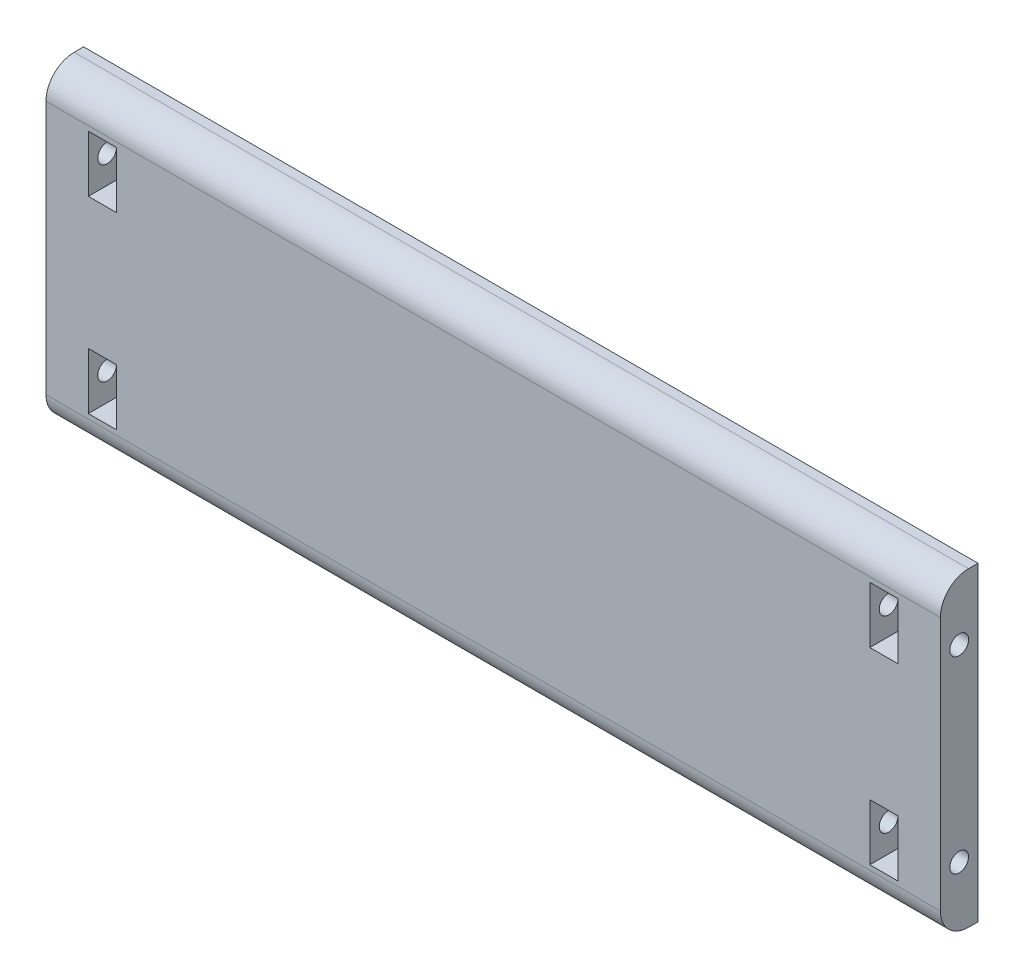
ISO-10303-21;
HEADER;
FILE_DESCRIPTION(('STEP AP214'),'2;1');
FILE_NAME('part.step','',(''),(''),'','','');
FILE_SCHEMA(('AUTOMOTIVE_DESIGN { 1 0 10303 214 1 1 1 1 }'));
ENDSEC;
DATA;
#1=APPLICATION_CONTEXT('core data for automotive mechanical design processes');
#2=APPLICATION_PROTOCOL_DEFINITION('international standard','automotive_design',2000,#1);
#3=PRODUCT_CONTEXT('',#1,'mechanical');
#4=PRODUCT('Part','Part','',(#3));
#5=PRODUCT_RELATED_PRODUCT_CATEGORY('part','',(#4));
#6=PRODUCT_DEFINITION_FORMATION('','',#4);
#7=PRODUCT_DEFINITION_CONTEXT('part definition',#1,'design');
#8=PRODUCT_DEFINITION('design','',#6,#7);
#9=PRODUCT_DEFINITION_SHAPE('','',#8);
#10=(LENGTH_UNIT() NAMED_UNIT(*) SI_UNIT(.MILLI.,.METRE.));
#11=(NAMED_UNIT(*) PLANE_ANGLE_UNIT() SI_UNIT($,.RADIAN.));
#12=(NAMED_UNIT(*) SI_UNIT($,.STERADIAN.) SOLID_ANGLE_UNIT());
#13=UNCERTAINTY_MEASURE_WITH_UNIT(LENGTH_MEASURE(1.E-05),#10,'distance_accuracy_value','');
#14=(GEOMETRIC_REPRESENTATION_CONTEXT(3) GLOBAL_UNCERTAINTY_ASSIGNED_CONTEXT((#13)) GLOBAL_UNIT_ASSIGNED_CONTEXT((#10,
#11,#12)) REPRESENTATION_CONTEXT('',''));
#15=CARTESIAN_POINT('',(0.,0.,0.));
#16=DIRECTION('',(0.,0.,1.));
#17=DIRECTION('',(1.,0.,0.));
#18=AXIS2_PLACEMENT_3D('',#15,#16,#17);
#19=CARTESIAN_POINT('',(0.,0.,4.));
#20=DIRECTION('',(0.,0.,1.));
#21=DIRECTION('',(1.,0.,0.));
#22=AXIS2_PLACEMENT_3D('',#19,#20,#21);
#23=PLANE('',#22);
#24=DIRECTION('',(-1.,0.,0.));
#25=VECTOR('',#24,1.);
#26=CARTESIAN_POINT('',(43.0399999999998,-6.99999999999997,4.));
#27=LINE('',#26,#25);
#28=CARTESIAN_POINT('',(43.0399999999998,-6.99999999999997,4.));
#29=VERTEX_POINT('',#28);
#30=CARTESIAN_POINT('',(40.0399999999998,-6.99999999999997,4.));
#31=VERTEX_POINT('',#30);
#32=EDGE_CURVE('E230',#29,#31,#27,.T.);
#33=ORIENTED_EDGE('',*,*,#32,.F.);
#34=DIRECTION('',(0.,1.,0.));
#35=VECTOR('',#34,1.);
#36=CARTESIAN_POINT('',(43.0399999999998,-6.99999999999997,4.));
#37=LINE('',#36,#35);
#38=CARTESIAN_POINT('',(43.0399999999998,-13.,4.));
#39=VERTEX_POINT('',#38);
#40=EDGE_CURVE('E228',#39,#29,#37,.T.);
#41=ORIENTED_EDGE('',*,*,#40,.F.);
#42=DIRECTION('',(1.,0.,0.));
#43=VECTOR('',#42,1.);
#44=CARTESIAN_POINT('',(43.0399999999998,-13.,4.));
#45=LINE('',#44,#43);
#46=CARTESIAN_POINT('',(40.0399999999998,-13.,4.));
#47=VERTEX_POINT('',#46);
#48=EDGE_CURVE('E236',#47,#39,#45,.T.);
#49=ORIENTED_EDGE('',*,*,#48,.F.);
#50=DIRECTION('',(0.,-1.,0.));
#51=VECTOR('',#50,1.);
#52=CARTESIAN_POINT('',(40.0399999999998,-6.99999999999997,4.));
#53=LINE('',#52,#51);
#54=EDGE_CURVE('E233',#31,#47,#53,.T.);
#55=ORIENTED_EDGE('',*,*,#54,.F.);
#56=EDGE_LOOP('',(#33,#41,#49,#55));
#57=FACE_BOUND('',#56,.T.);
#58=DIRECTION('',(-1.,0.,0.));
#59=VECTOR('',#58,1.);
#60=CARTESIAN_POINT('',(-43.04,13.,4.));
#61=LINE('',#60,#59);
#62=CARTESIAN_POINT('',(-40.04,13.,4.));
#63=VERTEX_POINT('',#62);
#64=CARTESIAN_POINT('',(-43.04,13.,4.));
#65=VERTEX_POINT('',#64);
#66=EDGE_CURVE('E292',#63,#65,#61,.T.);
#67=ORIENTED_EDGE('',*,*,#66,.F.);
#68=DIRECTION('',(0.,1.,0.));
#69=VECTOR('',#68,1.);
#70=CARTESIAN_POINT('',(-40.04,13.,4.));
#71=LINE('',#70,#69);
#72=CARTESIAN_POINT('',(-40.04,7.,4.));
#73=VERTEX_POINT('',#72);
#74=EDGE_CURVE('E290',#73,#63,#71,.T.);
#75=ORIENTED_EDGE('',*,*,#74,.F.);
#76=DIRECTION('',(1.,0.,0.));
#77=VECTOR('',#76,1.);
#78=CARTESIAN_POINT('',(-43.04,7.,4.));
#79=LINE('',#78,#77);
#80=CARTESIAN_POINT('',(-43.04,7.,4.));
#81=VERTEX_POINT('',#80);
#82=EDGE_CURVE('E298',#81,#73,#79,.T.);
#83=ORIENTED_EDGE('',*,*,#82,.F.);
#84=DIRECTION('',(0.,-1.,0.));
#85=VECTOR('',#84,1.);
#86=CARTESIAN_POINT('',(-43.04,13.,4.));
#87=LINE('',#86,#85);
#88=EDGE_CURVE('E295',#65,#81,#87,.T.);
#89=ORIENTED_EDGE('',*,*,#88,.F.);
#90=EDGE_LOOP('',(#67,#75,#83,#89));
#91=FACE_BOUND('',#90,.T.);
#92=DIRECTION('',(0.,1.,0.));
#93=VECTOR('',#92,1.);
#94=CARTESIAN_POINT('',(47.54,16.51,4.));
#95=LINE('',#94,#93);
#96=CARTESIAN_POINT('',(47.54,-13.51,4.));
#97=VERTEX_POINT('',#96);
#98=CARTESIAN_POINT('',(47.54,13.51,4.));
#99=VERTEX_POINT('',#98);
#100=EDGE_CURVE('E321',#97,#99,#95,.T.);
#101=ORIENTED_EDGE('',*,*,#100,.T.);
#102=DIRECTION('',(-1.,0.,0.));
#103=VECTOR('',#102,1.);
#104=CARTESIAN_POINT('',(-47.54,13.51,4.));
#105=LINE('',#104,#103);
#106=CARTESIAN_POINT('',(-47.54,13.51,4.));
#107=VERTEX_POINT('',#106);
#108=EDGE_CURVE('E349',#99,#107,#105,.T.);
#109=ORIENTED_EDGE('',*,*,#108,.T.);
#110=DIRECTION('',(0.,-1.,0.));
#111=VECTOR('',#110,1.);
#112=CARTESIAN_POINT('',(-47.54,16.51,4.));
#113=LINE('',#112,#111);
#114=CARTESIAN_POINT('',(-47.54,-13.51,4.));
#115=VERTEX_POINT('',#114);
#116=EDGE_CURVE('E324',#107,#115,#113,.T.);
#117=ORIENTED_EDGE('',*,*,#116,.T.);
#118=DIRECTION('',(1.,0.,0.));
#119=VECTOR('',#118,1.);
#120=CARTESIAN_POINT('',(47.54,-13.51,4.));
#121=LINE('',#120,#119);
#122=EDGE_CURVE('E346',#115,#97,#121,.T.);
#123=ORIENTED_EDGE('',*,*,#122,.T.);
#124=EDGE_LOOP('',(#101,#109,#117,#123));
#125=FACE_BOUND('',#124,.T.);
#126=DIRECTION('',(-1.,0.,0.));
#127=VECTOR('',#126,1.);
#128=CARTESIAN_POINT('',(-43.0399999999998,-6.99999999999998,4.));
#129=LINE('',#128,#127);
#130=CARTESIAN_POINT('',(-40.0399999999998,-6.99999999999998,4.));
#131=VERTEX_POINT('',#130);
#132=CARTESIAN_POINT('',(-43.0399999999998,-6.99999999999998,4.));
#133=VERTEX_POINT('',#132);
#134=EDGE_CURVE('E261',#131,#133,#129,.T.);
#135=ORIENTED_EDGE('',*,*,#134,.F.);
#136=DIRECTION('',(0.,1.,0.));
#137=VECTOR('',#136,1.);
#138=CARTESIAN_POINT('',(-40.0399999999998,-6.99999999999998,4.));
#139=LINE('',#138,#137);
#140=CARTESIAN_POINT('',(-40.0399999999998,-13.,4.));
#141=VERTEX_POINT('',#140);
#142=EDGE_CURVE('E259',#141,#131,#139,.T.);
#143=ORIENTED_EDGE('',*,*,#142,.F.);
#144=DIRECTION('',(1.,0.,0.));
#145=VECTOR('',#144,1.);
#146=CARTESIAN_POINT('',(-43.0399999999998,-13.,4.));
#147=LINE('',#146,#145);
#148=CARTESIAN_POINT('',(-43.0399999999998,-13.,4.));
#149=VERTEX_POINT('',#148);
#150=EDGE_CURVE('E267',#149,#141,#147,.T.);
#151=ORIENTED_EDGE('',*,*,#150,.F.);
#152=DIRECTION('',(0.,-1.,0.));
#153=VECTOR('',#152,1.);
#154=CARTESIAN_POINT('',(-43.0399999999998,-6.99999999999998,4.));
#155=LINE('',#154,#153);
#156=EDGE_CURVE('E264',#133,#149,#155,.T.);
#157=ORIENTED_EDGE('',*,*,#156,.F.);
#158=EDGE_LOOP('',(#135,#143,#151,#157));
#159=FACE_BOUND('',#158,.T.);
#160=DIRECTION('',(-1.,0.,0.));
#161=VECTOR('',#160,1.);
#162=CARTESIAN_POINT('',(43.04,13.,4.));
#163=LINE('',#162,#161);
#164=CARTESIAN_POINT('',(43.04,13.,4.));
#165=VERTEX_POINT('',#164);
#166=CARTESIAN_POINT('',(40.04,13.,4.));
#167=VERTEX_POINT('',#166);
#168=EDGE_CURVE('E195',#165,#167,#163,.T.);
#169=ORIENTED_EDGE('',*,*,#168,.F.);
#170=DIRECTION('',(0.,1.,0.));
#171=VECTOR('',#170,1.);
#172=CARTESIAN_POINT('',(43.04,13.,4.));
#173=LINE('',#172,#171);
#174=CARTESIAN_POINT('',(43.04,7.00000000000001,4.));
#175=VERTEX_POINT('',#174);
#176=EDGE_CURVE('E185',#175,#165,#173,.T.);
#177=ORIENTED_EDGE('',*,*,#176,.F.);
#178=DIRECTION('',(1.,0.,0.));
#179=VECTOR('',#178,1.);
#180=CARTESIAN_POINT('',(43.04,7.00000000000001,4.));
#181=LINE('',#180,#179);
#182=CARTESIAN_POINT('',(40.04,7.00000000000001,4.));
#183=VERTEX_POINT('',#182);
#184=EDGE_CURVE('E210',#183,#175,#181,.T.);
#185=ORIENTED_EDGE('',*,*,#184,.F.);
#186=DIRECTION('',(0.,-1.,0.));
#187=VECTOR('',#186,1.);
#188=CARTESIAN_POINT('',(40.04,13.,4.));
#189=LINE('',#188,#187);
#190=EDGE_CURVE('E208',#167,#183,#189,.T.);
#191=ORIENTED_EDGE('',*,*,#190,.F.);
#192=EDGE_LOOP('',(#169,#177,#185,#191));
#193=FACE_BOUND('',#192,.T.);
#194=ADVANCED_FACE('F33',(#57,#91,#125,#159,#193),#23,.T.);
#195=CARTESIAN_POINT('',(0.,0.,0.));
#196=DIRECTION('',(0.,0.,1.));
#197=DIRECTION('',(1.,0.,0.));
#198=AXIS2_PLACEMENT_3D('',#195,#196,#197);
#199=PLANE('',#198);
#200=DIRECTION('',(0.,1.,0.));
#201=VECTOR('',#200,1.);
#202=CARTESIAN_POINT('',(43.0399999999998,-6.99999999999997,0.));
#203=LINE('',#202,#201);
#204=CARTESIAN_POINT('',(43.0399999999998,-13.,0.));
#205=VERTEX_POINT('',#204);
#206=CARTESIAN_POINT('',(43.0399999999998,-6.99999999999997,0.));
#207=VERTEX_POINT('',#206);
#208=EDGE_CURVE('E203',#205,#207,#203,.T.);
#209=ORIENTED_EDGE('',*,*,#208,.T.);
#210=DIRECTION('',(-1.,0.,0.));
#211=VECTOR('',#210,1.);
#212=CARTESIAN_POINT('',(43.0399999999998,-6.99999999999997,0.));
#213=LINE('',#212,#211);
#214=CARTESIAN_POINT('',(40.0399999999998,-6.99999999999997,0.));
#215=VERTEX_POINT('',#214);
#216=EDGE_CURVE('E241',#207,#215,#213,.T.);
#217=ORIENTED_EDGE('',*,*,#216,.T.);
#218=DIRECTION('',(0.,-1.,0.));
#219=VECTOR('',#218,1.);
#220=CARTESIAN_POINT('',(40.0399999999998,-6.99999999999997,0.));
#221=LINE('',#220,#219);
#222=CARTESIAN_POINT('',(40.0399999999998,-13.,0.));
#223=VERTEX_POINT('',#222);
#224=EDGE_CURVE('E244',#215,#223,#221,.T.);
#225=ORIENTED_EDGE('',*,*,#224,.T.);
#226=DIRECTION('',(1.,0.,0.));
#227=VECTOR('',#226,1.);
#228=CARTESIAN_POINT('',(43.0399999999998,-13.,0.));
#229=LINE('',#228,#227);
#230=EDGE_CURVE('E231',#223,#205,#229,.T.);
#231=ORIENTED_EDGE('',*,*,#230,.T.);
#232=EDGE_LOOP('',(#209,#217,#225,#231));
#233=FACE_BOUND('',#232,.T.);
#234=DIRECTION('',(0.,1.,0.));
#235=VECTOR('',#234,1.);
#236=CARTESIAN_POINT('',(-40.04,13.,0.));
#237=LINE('',#236,#235);
#238=CARTESIAN_POINT('',(-40.04,7.,0.));
#239=VERTEX_POINT('',#238);
#240=CARTESIAN_POINT('',(-40.04,13.,0.));
#241=VERTEX_POINT('',#240);
#242=EDGE_CURVE('E289',#239,#241,#237,.T.);
#243=ORIENTED_EDGE('',*,*,#242,.T.);
#244=DIRECTION('',(-1.,0.,0.));
#245=VECTOR('',#244,1.);
#246=CARTESIAN_POINT('',(-43.04,13.,0.));
#247=LINE('',#246,#245);
#248=CARTESIAN_POINT('',(-43.04,13.,0.));
#249=VERTEX_POINT('',#248);
#250=EDGE_CURVE('E303',#241,#249,#247,.T.);
#251=ORIENTED_EDGE('',*,*,#250,.T.);
#252=DIRECTION('',(0.,-1.,0.));
#253=VECTOR('',#252,1.);
#254=CARTESIAN_POINT('',(-43.04,13.,0.));
#255=LINE('',#254,#253);
#256=CARTESIAN_POINT('',(-43.04,7.,0.));
#257=VERTEX_POINT('',#256);
#258=EDGE_CURVE('E306',#249,#257,#255,.T.);
#259=ORIENTED_EDGE('',*,*,#258,.T.);
#260=DIRECTION('',(1.,0.,0.));
#261=VECTOR('',#260,1.);
#262=CARTESIAN_POINT('',(-43.04,7.,0.));
#263=LINE('',#262,#261);
#264=EDGE_CURVE('E293',#257,#239,#263,.T.);
#265=ORIENTED_EDGE('',*,*,#264,.T.);
#266=EDGE_LOOP('',(#243,#251,#259,#265));
#267=FACE_BOUND('',#266,.T.);
#268=DIRECTION('',(0.,1.,0.));
#269=VECTOR('',#268,1.);
#270=CARTESIAN_POINT('',(47.54,16.51,0.));
#271=LINE('',#270,#269);
#272=CARTESIAN_POINT('',(47.54,-16.51,0.));
#273=VERTEX_POINT('',#272);
#274=CARTESIAN_POINT('',(47.54,16.51,0.));
#275=VERTEX_POINT('',#274);
#276=EDGE_CURVE('E320',#273,#275,#271,.T.);
#277=ORIENTED_EDGE('',*,*,#276,.F.);
#278=DIRECTION('',(1.,0.,0.));
#279=VECTOR('',#278,1.);
#280=CARTESIAN_POINT('',(-47.54,-16.51,0.));
#281=LINE('',#280,#279);
#282=CARTESIAN_POINT('',(-47.54,-16.51,0.));
#283=VERTEX_POINT('',#282);
#284=EDGE_CURVE('E325',#283,#273,#281,.T.);
#285=ORIENTED_EDGE('',*,*,#284,.F.);
#286=DIRECTION('',(0.,-1.,0.));
#287=VECTOR('',#286,1.);
#288=CARTESIAN_POINT('',(-47.54,16.51,0.));
#289=LINE('',#288,#287);
#290=CARTESIAN_POINT('',(-47.54,16.51,0.));
#291=VERTEX_POINT('',#290);
#292=EDGE_CURVE('E334',#291,#283,#289,.T.);
#293=ORIENTED_EDGE('',*,*,#292,.F.);
#294=DIRECTION('',(-1.,0.,0.));
#295=VECTOR('',#294,1.);
#296=CARTESIAN_POINT('',(-47.54,16.51,0.));
#297=LINE('',#296,#295);
#298=EDGE_CURVE('E331',#275,#291,#297,.T.);
#299=ORIENTED_EDGE('',*,*,#298,.F.);
#300=EDGE_LOOP('',(#277,#285,#293,#299));
#301=FACE_BOUND('',#300,.T.);
#302=DIRECTION('',(0.,1.,0.));
#303=VECTOR('',#302,1.);
#304=CARTESIAN_POINT('',(-40.0399999999998,-6.99999999999998,0.));
#305=LINE('',#304,#303);
#306=CARTESIAN_POINT('',(-40.0399999999998,-13.,0.));
#307=VERTEX_POINT('',#306);
#308=CARTESIAN_POINT('',(-40.0399999999998,-6.99999999999998,0.));
#309=VERTEX_POINT('',#308);
#310=EDGE_CURVE('E258',#307,#309,#305,.T.);
#311=ORIENTED_EDGE('',*,*,#310,.T.);
#312=DIRECTION('',(-1.,0.,0.));
#313=VECTOR('',#312,1.);
#314=CARTESIAN_POINT('',(-43.0399999999998,-6.99999999999998,0.));
#315=LINE('',#314,#313);
#316=CARTESIAN_POINT('',(-43.0399999999998,-6.99999999999998,0.));
#317=VERTEX_POINT('',#316);
#318=EDGE_CURVE('E272',#309,#317,#315,.T.);
#319=ORIENTED_EDGE('',*,*,#318,.T.);
#320=DIRECTION('',(0.,-1.,0.));
#321=VECTOR('',#320,1.);
#322=CARTESIAN_POINT('',(-43.0399999999998,-6.99999999999998,0.));
#323=LINE('',#322,#321);
#324=CARTESIAN_POINT('',(-43.0399999999998,-13.,0.));
#325=VERTEX_POINT('',#324);
#326=EDGE_CURVE('E275',#317,#325,#323,.T.);
#327=ORIENTED_EDGE('',*,*,#326,.T.);
#328=DIRECTION('',(1.,0.,0.));
#329=VECTOR('',#328,1.);
#330=CARTESIAN_POINT('',(-43.0399999999998,-13.,0.));
#331=LINE('',#330,#329);
#332=EDGE_CURVE('E262',#325,#307,#331,.T.);
#333=ORIENTED_EDGE('',*,*,#332,.T.);
#334=EDGE_LOOP('',(#311,#319,#327,#333));
#335=FACE_BOUND('',#334,.T.);
#336=DIRECTION('',(0.,1.,0.));
#337=VECTOR('',#336,1.);
#338=CARTESIAN_POINT('',(43.04,13.,0.));
#339=LINE('',#338,#337);
#340=CARTESIAN_POINT('',(43.04,7.00000000000001,0.));
#341=VERTEX_POINT('',#340);
#342=CARTESIAN_POINT('',(43.04,13.,0.));
#343=VERTEX_POINT('',#342);
#344=EDGE_CURVE('E215',#341,#343,#339,.T.);
#345=ORIENTED_EDGE('',*,*,#344,.T.);
#346=DIRECTION('',(-1.,0.,0.));
#347=VECTOR('',#346,1.);
#348=CARTESIAN_POINT('',(43.04,13.,0.));
#349=LINE('',#348,#347);
#350=CARTESIAN_POINT('',(40.04,13.,0.));
#351=VERTEX_POINT('',#350);
#352=EDGE_CURVE('E202',#343,#351,#349,.T.);
#353=ORIENTED_EDGE('',*,*,#352,.T.);
#354=DIRECTION('',(0.,-1.,0.));
#355=VECTOR('',#354,1.);
#356=CARTESIAN_POINT('',(40.04,13.,0.));
#357=LINE('',#356,#355);
#358=CARTESIAN_POINT('',(40.04,7.00000000000001,0.));
#359=VERTEX_POINT('',#358);
#360=EDGE_CURVE('E219',#351,#359,#357,.T.);
#361=ORIENTED_EDGE('',*,*,#360,.T.);
#362=DIRECTION('',(1.,0.,0.));
#363=VECTOR('',#362,1.);
#364=CARTESIAN_POINT('',(43.04,7.00000000000001,0.));
#365=LINE('',#364,#363);
#366=EDGE_CURVE('E196',#359,#341,#365,.T.);
#367=ORIENTED_EDGE('',*,*,#366,.T.);
#368=EDGE_LOOP('',(#345,#353,#361,#367));
#369=FACE_BOUND('',#368,.T.);
#370=ADVANCED_FACE('F416',(#233,#267,#301,#335,#369),#199,.F.);
#371=CARTESIAN_POINT('',(47.54,16.51,4.));
#372=DIRECTION('',(-1.,0.,0.));
#373=DIRECTION('',(0.,-1.,0.));
#374=AXIS2_PLACEMENT_3D('',#371,#372,#373);
#375=PLANE('',#374);
#376=CARTESIAN_POINT('',(47.54,-9.99999999999999,1.99999999999979));
#377=DIRECTION('',(1.,0.,0.));
#378=DIRECTION('',(0.,1.,0.));
#379=AXIS2_PLACEMENT_3D('',#376,#377,#378);
#380=CIRCLE('',#379,1.);
#381=CARTESIAN_POINT('',(47.54,-8.99999999999999,1.99999999999979));
#382=VERTEX_POINT('',#381);
#383=EDGE_CURVE('E374',#382,#382,#380,.T.);
#384=ORIENTED_EDGE('',*,*,#383,.F.);
#385=EDGE_LOOP('',(#384));
#386=FACE_BOUND('',#385,.T.);
#387=CARTESIAN_POINT('',(47.54,10.,2.));
#388=DIRECTION('',(1.,0.,0.));
#389=DIRECTION('',(0.,1.,0.));
#390=AXIS2_PLACEMENT_3D('',#387,#388,#389);
#391=CIRCLE('',#390,1.);
#392=CARTESIAN_POINT('',(47.54,11.,2.));
#393=VERTEX_POINT('',#392);
#394=EDGE_CURVE('E393',#393,#393,#391,.T.);
#395=ORIENTED_EDGE('',*,*,#394,.F.);
#396=EDGE_LOOP('',(#395));
#397=FACE_BOUND('',#396,.T.);
#398=DIRECTION('',(0.,0.,-1.));
#399=VECTOR('',#398,1.);
#400=CARTESIAN_POINT('',(47.54,16.51,4.));
#401=LINE('',#400,#399);
#402=CARTESIAN_POINT('',(47.54,16.51,1.));
#403=VERTEX_POINT('',#402);
#404=EDGE_CURVE('E344',#403,#275,#401,.T.);
#405=ORIENTED_EDGE('',*,*,#404,.F.);
#406=CARTESIAN_POINT('',(47.54,13.51,1.));
#407=DIRECTION('',(-1.,0.,0.));
#408=DIRECTION('',(0.,-1.,0.));
#409=AXIS2_PLACEMENT_3D('',#406,#407,#408);
#410=CIRCLE('',#409,3.);
#411=EDGE_CURVE('E42',#403,#99,#410,.F.);
#412=ORIENTED_EDGE('',*,*,#411,.T.);
#413=ORIENTED_EDGE('',*,*,#100,.F.);
#414=CARTESIAN_POINT('',(47.54,-13.51,1.));
#415=DIRECTION('',(-1.,0.,0.));
#416=DIRECTION('',(0.,-1.,0.));
#417=AXIS2_PLACEMENT_3D('',#414,#415,#416);
#418=CIRCLE('',#417,3.);
#419=CARTESIAN_POINT('',(47.54,-16.51,1.));
#420=VERTEX_POINT('',#419);
#421=EDGE_CURVE('E50',#97,#420,#418,.F.);
#422=ORIENTED_EDGE('',*,*,#421,.T.);
#423=DIRECTION('',(0.,0.,-1.));
#424=VECTOR('',#423,1.);
#425=CARTESIAN_POINT('',(47.54,-16.51,4.));
#426=LINE('',#425,#424);
#427=EDGE_CURVE('E328',#420,#273,#426,.T.);
#428=ORIENTED_EDGE('',*,*,#427,.T.);
#429=ORIENTED_EDGE('',*,*,#276,.T.);
#430=EDGE_LOOP('',(#405,#412,#413,#422,#428,#429));
#431=FACE_BOUND('',#430,.T.);
#432=ADVANCED_FACE('F422',(#386,#397,#431),#375,.F.);
#433=CARTESIAN_POINT('',(-47.54,16.51,4.));
#434=DIRECTION('',(0.,-1.,0.));
#435=DIRECTION('',(1.,0.,0.));
#436=AXIS2_PLACEMENT_3D('',#433,#434,#435);
#437=PLANE('',#436);
#438=DIRECTION('',(0.,0.,-1.));
#439=VECTOR('',#438,1.);
#440=CARTESIAN_POINT('',(-47.54,16.51,4.));
#441=LINE('',#440,#439);
#442=CARTESIAN_POINT('',(-47.54,16.51,1.));
#443=VERTEX_POINT('',#442);
#444=EDGE_CURVE('E342',#443,#291,#441,.T.);
#445=ORIENTED_EDGE('',*,*,#444,.F.);
#446=DIRECTION('',(-1.,0.,0.));
#447=VECTOR('',#446,1.);
#448=CARTESIAN_POINT('',(47.54,16.51,1.));
#449=LINE('',#448,#447);
#450=EDGE_CURVE('E58',#443,#403,#449,.F.);
#451=ORIENTED_EDGE('',*,*,#450,.T.);
#452=ORIENTED_EDGE('',*,*,#404,.T.);
#453=ORIENTED_EDGE('',*,*,#298,.T.);
#454=EDGE_LOOP('',(#445,#451,#452,#453));
#455=FACE_BOUND('',#454,.T.);
#456=ADVANCED_FACE('F438',(#455),#437,.F.);
#457=CARTESIAN_POINT('',(-47.54,16.51,4.));
#458=DIRECTION('',(1.,0.,0.));
#459=DIRECTION('',(0.,1.,0.));
#460=AXIS2_PLACEMENT_3D('',#457,#458,#459);
#461=PLANE('',#460);
#462=CARTESIAN_POINT('',(-47.54,-10.,2.00000000000021));
#463=DIRECTION('',(-1.,0.,0.));
#464=DIRECTION('',(0.,-1.,0.));
#465=AXIS2_PLACEMENT_3D('',#462,#463,#464);
#466=CIRCLE('',#465,1.);
#467=CARTESIAN_POINT('',(-47.54,-11.,2.00000000000021));
#468=VERTEX_POINT('',#467);
#469=EDGE_CURVE('E522',#468,#468,#466,.T.);
#470=ORIENTED_EDGE('',*,*,#469,.F.);
#471=EDGE_LOOP('',(#470));
#472=FACE_BOUND('',#471,.T.);
#473=CARTESIAN_POINT('',(-47.54,10.,2.));
#474=DIRECTION('',(-1.,0.,0.));
#475=DIRECTION('',(0.,-1.,0.));
#476=AXIS2_PLACEMENT_3D('',#473,#474,#475);
#477=CIRCLE('',#476,1.);
#478=CARTESIAN_POINT('',(-47.54,9.,2.));
#479=VERTEX_POINT('',#478);
#480=EDGE_CURVE('E377',#479,#479,#477,.T.);
#481=ORIENTED_EDGE('',*,*,#480,.F.);
#482=EDGE_LOOP('',(#481));
#483=FACE_BOUND('',#482,.T.);
#484=ORIENTED_EDGE('',*,*,#116,.F.);
#485=CARTESIAN_POINT('',(-47.54,13.51,1.));
#486=DIRECTION('',(1.,0.,0.));
#487=DIRECTION('',(0.,1.,0.));
#488=AXIS2_PLACEMENT_3D('',#485,#486,#487);
#489=CIRCLE('',#488,3.);
#490=EDGE_CURVE('E354',#107,#443,#489,.F.);
#491=ORIENTED_EDGE('',*,*,#490,.T.);
#492=ORIENTED_EDGE('',*,*,#444,.T.);
#493=ORIENTED_EDGE('',*,*,#292,.T.);
#494=DIRECTION('',(0.,0.,-1.));
#495=VECTOR('',#494,1.);
#496=CARTESIAN_POINT('',(-47.54,-16.51,4.));
#497=LINE('',#496,#495);
#498=CARTESIAN_POINT('',(-47.54,-16.51,1.));
#499=VERTEX_POINT('',#498);
#500=EDGE_CURVE('E340',#499,#283,#497,.T.);
#501=ORIENTED_EDGE('',*,*,#500,.F.);
#502=CARTESIAN_POINT('',(-47.54,-13.51,1.));
#503=DIRECTION('',(1.,0.,0.));
#504=DIRECTION('',(0.,1.,0.));
#505=AXIS2_PLACEMENT_3D('',#502,#503,#504);
#506=CIRCLE('',#505,3.);
#507=EDGE_CURVE('E352',#499,#115,#506,.F.);
#508=ORIENTED_EDGE('',*,*,#507,.T.);
#509=EDGE_LOOP('',(#484,#491,#492,#493,#501,#508));
#510=FACE_BOUND('',#509,.T.);
#511=ADVANCED_FACE('F434',(#472,#483,#510),#461,.F.);
#512=CARTESIAN_POINT('',(-47.54,-16.51,4.));
#513=DIRECTION('',(0.,1.,0.));
#514=DIRECTION('',(-1.,0.,0.));
#515=AXIS2_PLACEMENT_3D('',#512,#513,#514);
#516=PLANE('',#515);
#517=ORIENTED_EDGE('',*,*,#427,.F.);
#518=DIRECTION('',(1.,0.,0.));
#519=VECTOR('',#518,1.);
#520=CARTESIAN_POINT('',(-47.54,-16.51,1.));
#521=LINE('',#520,#519);
#522=EDGE_CURVE('E11',#420,#499,#521,.F.);
#523=ORIENTED_EDGE('',*,*,#522,.T.);
#524=ORIENTED_EDGE('',*,*,#500,.T.);
#525=ORIENTED_EDGE('',*,*,#284,.T.);
#526=EDGE_LOOP('',(#517,#523,#524,#525));
#527=FACE_BOUND('',#526,.T.);
#528=ADVANCED_FACE('F431',(#527),#516,.F.);
#529=CARTESIAN_POINT('',(-40.04,13.,4.));
#530=DIRECTION('',(-1.,0.,0.));
#531=DIRECTION('',(0.,0.,1.));
#532=AXIS2_PLACEMENT_3D('',#529,#530,#531);
#533=PLANE('',#532);
#534=CARTESIAN_POINT('',(-40.04,10.,2.));
#535=DIRECTION('',(-1.,0.,0.));
#536=DIRECTION('',(0.,0.,1.));
#537=AXIS2_PLACEMENT_3D('',#534,#535,#536);
#538=CIRCLE('',#537,1.);
#539=CARTESIAN_POINT('',(-40.04,10.,3.));
#540=VERTEX_POINT('',#539);
#541=EDGE_CURVE('E369',#540,#540,#538,.T.);
#542=ORIENTED_EDGE('',*,*,#541,.F.);
#543=EDGE_LOOP('',(#542));
#544=FACE_BOUND('',#543,.T.);
#545=ORIENTED_EDGE('',*,*,#242,.F.);
#546=DIRECTION('',(0.,0.,-1.));
#547=VECTOR('',#546,1.);
#548=CARTESIAN_POINT('',(-40.04,7.,4.));
#549=LINE('',#548,#547);
#550=EDGE_CURVE('E300',#73,#239,#549,.T.);
#551=ORIENTED_EDGE('',*,*,#550,.F.);
#552=ORIENTED_EDGE('',*,*,#74,.T.);
#553=DIRECTION('',(0.,0.,-1.));
#554=VECTOR('',#553,1.);
#555=CARTESIAN_POINT('',(-40.04,13.,4.));
#556=LINE('',#555,#554);
#557=EDGE_CURVE('E317',#63,#241,#556,.T.);
#558=ORIENTED_EDGE('',*,*,#557,.T.);
#559=EDGE_LOOP('',(#545,#551,#552,#558));
#560=FACE_BOUND('',#559,.T.);
#561=ADVANCED_FACE('F428',(#544,#560),#533,.T.);
#562=CARTESIAN_POINT('',(-43.04,13.,4.));
#563=DIRECTION('',(0.,-1.,0.));
#564=DIRECTION('',(0.,0.,-1.));
#565=AXIS2_PLACEMENT_3D('',#562,#563,#564);
#566=PLANE('',#565);
#567=ORIENTED_EDGE('',*,*,#250,.F.);
#568=ORIENTED_EDGE('',*,*,#557,.F.);
#569=ORIENTED_EDGE('',*,*,#66,.T.);
#570=DIRECTION('',(0.,0.,-1.));
#571=VECTOR('',#570,1.);
#572=CARTESIAN_POINT('',(-43.04,13.,4.));
#573=LINE('',#572,#571);
#574=EDGE_CURVE('E315',#65,#249,#573,.T.);
#575=ORIENTED_EDGE('',*,*,#574,.T.);
#576=EDGE_LOOP('',(#567,#568,#569,#575));
#577=FACE_BOUND('',#576,.T.);
#578=ADVANCED_FACE('F569',(#577),#566,.T.);
#579=CARTESIAN_POINT('',(-43.04,13.,4.));
#580=DIRECTION('',(1.,0.,0.));
#581=DIRECTION('',(0.,0.,-1.));
#582=AXIS2_PLACEMENT_3D('',#579,#580,#581);
#583=PLANE('',#582);
#584=CARTESIAN_POINT('',(-43.04,10.,2.));
#585=DIRECTION('',(1.,0.,0.));
#586=DIRECTION('',(0.,0.,-1.));
#587=AXIS2_PLACEMENT_3D('',#584,#585,#586);
#588=CIRCLE('',#587,1.);
#589=CARTESIAN_POINT('',(-43.04,10.,0.999999999999997));
#590=VERTEX_POINT('',#589);
#591=EDGE_CURVE('E367',#590,#590,#588,.T.);
#592=ORIENTED_EDGE('',*,*,#591,.F.);
#593=EDGE_LOOP('',(#592));
#594=FACE_BOUND('',#593,.T.);
#595=ORIENTED_EDGE('',*,*,#258,.F.);
#596=ORIENTED_EDGE('',*,*,#574,.F.);
#597=ORIENTED_EDGE('',*,*,#88,.T.);
#598=DIRECTION('',(0.,0.,-1.));
#599=VECTOR('',#598,1.);
#600=CARTESIAN_POINT('',(-43.04,7.,4.));
#601=LINE('',#600,#599);
#602=EDGE_CURVE('E313',#81,#257,#601,.T.);
#603=ORIENTED_EDGE('',*,*,#602,.T.);
#604=EDGE_LOOP('',(#595,#596,#597,#603));
#605=FACE_BOUND('',#604,.T.);
#606=ADVANCED_FACE('F566',(#594,#605),#583,.T.);
#607=CARTESIAN_POINT('',(-43.04,7.,4.));
#608=DIRECTION('',(0.,1.,0.));
#609=DIRECTION('',(0.,0.,1.));
#610=AXIS2_PLACEMENT_3D('',#607,#608,#609);
#611=PLANE('',#610);
#612=ORIENTED_EDGE('',*,*,#264,.F.);
#613=ORIENTED_EDGE('',*,*,#602,.F.);
#614=ORIENTED_EDGE('',*,*,#82,.T.);
#615=ORIENTED_EDGE('',*,*,#550,.T.);
#616=EDGE_LOOP('',(#612,#613,#614,#615));
#617=FACE_BOUND('',#616,.T.);
#618=ADVANCED_FACE('F539',(#617),#611,.T.);
#619=CARTESIAN_POINT('',(-40.0399999999998,-6.99999999999998,4.));
#620=DIRECTION('',(-1.,0.,0.));
#621=DIRECTION('',(0.,0.,1.));
#622=AXIS2_PLACEMENT_3D('',#619,#620,#621);
#623=PLANE('',#622);
#624=CARTESIAN_POINT('',(-40.0399999999998,-10.,2.00000000000021));
#625=DIRECTION('',(-1.,0.,0.));
#626=DIRECTION('',(0.,0.,1.));
#627=AXIS2_PLACEMENT_3D('',#624,#625,#626);
#628=CIRCLE('',#627,1.);
#629=CARTESIAN_POINT('',(-40.0399999999998,-10.,3.00000000000021));
#630=VERTEX_POINT('',#629);
#631=EDGE_CURVE('E382',#630,#630,#628,.T.);
#632=ORIENTED_EDGE('',*,*,#631,.F.);
#633=EDGE_LOOP('',(#632));
#634=FACE_BOUND('',#633,.T.);
#635=ORIENTED_EDGE('',*,*,#310,.F.);
#636=DIRECTION('',(0.,0.,-1.));
#637=VECTOR('',#636,1.);
#638=CARTESIAN_POINT('',(-40.0399999999998,-13.,4.));
#639=LINE('',#638,#637);
#640=EDGE_CURVE('E269',#141,#307,#639,.T.);
#641=ORIENTED_EDGE('',*,*,#640,.F.);
#642=ORIENTED_EDGE('',*,*,#142,.T.);
#643=DIRECTION('',(0.,0.,-1.));
#644=VECTOR('',#643,1.);
#645=CARTESIAN_POINT('',(-40.0399999999998,-6.99999999999998,4.));
#646=LINE('',#645,#644);
#647=EDGE_CURVE('E286',#131,#309,#646,.T.);
#648=ORIENTED_EDGE('',*,*,#647,.T.);
#649=EDGE_LOOP('',(#635,#641,#642,#648));
#650=FACE_BOUND('',#649,.T.);
#651=ADVANCED_FACE('F535',(#634,#650),#623,.T.);
#652=CARTESIAN_POINT('',(-43.0399999999998,-6.99999999999998,4.));
#653=DIRECTION('',(0.,-1.,0.));
#654=DIRECTION('',(0.,0.,-1.));
#655=AXIS2_PLACEMENT_3D('',#652,#653,#654);
#656=PLANE('',#655);
#657=ORIENTED_EDGE('',*,*,#318,.F.);
#658=ORIENTED_EDGE('',*,*,#647,.F.);
#659=ORIENTED_EDGE('',*,*,#134,.T.);
#660=DIRECTION('',(0.,0.,-1.));
#661=VECTOR('',#660,1.);
#662=CARTESIAN_POINT('',(-43.0399999999998,-6.99999999999998,4.));
#663=LINE('',#662,#661);
#664=EDGE_CURVE('E284',#133,#317,#663,.T.);
#665=ORIENTED_EDGE('',*,*,#664,.T.);
#666=EDGE_LOOP('',(#657,#658,#659,#665));
#667=FACE_BOUND('',#666,.T.);
#668=ADVANCED_FACE('F538',(#667),#656,.T.);
#669=CARTESIAN_POINT('',(-43.0399999999998,-6.99999999999998,4.));
#670=DIRECTION('',(1.,0.,0.));
#671=DIRECTION('',(0.,0.,-1.));
#672=AXIS2_PLACEMENT_3D('',#669,#670,#671);
#673=PLANE('',#672);
#674=CARTESIAN_POINT('',(-43.0399999999998,-10.,2.00000000000021));
#675=DIRECTION('',(1.,0.,0.));
#676=DIRECTION('',(0.,0.,-1.));
#677=AXIS2_PLACEMENT_3D('',#674,#675,#676);
#678=CIRCLE('',#677,1.);
#679=CARTESIAN_POINT('',(-43.0399999999998,-10.,1.00000000000021));
#680=VERTEX_POINT('',#679);
#681=EDGE_CURVE('E37',#680,#680,#678,.T.);
#682=ORIENTED_EDGE('',*,*,#681,.F.);
#683=EDGE_LOOP('',(#682));
#684=FACE_BOUND('',#683,.T.);
#685=ORIENTED_EDGE('',*,*,#326,.F.);
#686=ORIENTED_EDGE('',*,*,#664,.F.);
#687=ORIENTED_EDGE('',*,*,#156,.T.);
#688=DIRECTION('',(0.,0.,-1.));
#689=VECTOR('',#688,1.);
#690=CARTESIAN_POINT('',(-43.0399999999998,-13.,4.));
#691=LINE('',#690,#689);
#692=EDGE_CURVE('E282',#149,#325,#691,.T.);
#693=ORIENTED_EDGE('',*,*,#692,.T.);
#694=EDGE_LOOP('',(#685,#686,#687,#693));
#695=FACE_BOUND('',#694,.T.);
#696=ADVANCED_FACE('F551',(#684,#695),#673,.T.);
#697=CARTESIAN_POINT('',(-43.0399999999998,-13.,4.));
#698=DIRECTION('',(0.,1.,0.));
#699=DIRECTION('',(0.,0.,1.));
#700=AXIS2_PLACEMENT_3D('',#697,#698,#699);
#701=PLANE('',#700);
#702=ORIENTED_EDGE('',*,*,#332,.F.);
#703=ORIENTED_EDGE('',*,*,#692,.F.);
#704=ORIENTED_EDGE('',*,*,#150,.T.);
#705=ORIENTED_EDGE('',*,*,#640,.T.);
#706=EDGE_LOOP('',(#702,#703,#704,#705));
#707=FACE_BOUND('',#706,.T.);
#708=ADVANCED_FACE('F546',(#707),#701,.T.);
#709=CARTESIAN_POINT('',(43.0399999999998,-6.99999999999997,4.));
#710=DIRECTION('',(-1.,0.,0.));
#711=DIRECTION('',(0.,-1.,0.));
#712=AXIS2_PLACEMENT_3D('',#709,#710,#711);
#713=PLANE('',#712);
#714=CARTESIAN_POINT('',(43.0399999999998,-9.99999999999999,1.99999999999979));
#715=DIRECTION('',(-1.,0.,0.));
#716=DIRECTION('',(0.,-1.,0.));
#717=AXIS2_PLACEMENT_3D('',#714,#715,#716);
#718=CIRCLE('',#717,1.);
#719=CARTESIAN_POINT('',(43.0399999999998,-11.,1.99999999999979));
#720=VERTEX_POINT('',#719);
#721=EDGE_CURVE('E365',#720,#720,#718,.T.);
#722=ORIENTED_EDGE('',*,*,#721,.F.);
#723=EDGE_LOOP('',(#722));
#724=FACE_BOUND('',#723,.T.);
#725=ORIENTED_EDGE('',*,*,#208,.F.);
#726=DIRECTION('',(0.,0.,-1.));
#727=VECTOR('',#726,1.);
#728=CARTESIAN_POINT('',(43.0399999999998,-13.,4.));
#729=LINE('',#728,#727);
#730=EDGE_CURVE('E238',#39,#205,#729,.T.);
#731=ORIENTED_EDGE('',*,*,#730,.F.);
#732=ORIENTED_EDGE('',*,*,#40,.T.);
#733=DIRECTION('',(0.,0.,-1.));
#734=VECTOR('',#733,1.);
#735=CARTESIAN_POINT('',(43.0399999999998,-6.99999999999997,4.));
#736=LINE('',#735,#734);
#737=EDGE_CURVE('E255',#29,#207,#736,.T.);
#738=ORIENTED_EDGE('',*,*,#737,.T.);
#739=EDGE_LOOP('',(#725,#731,#732,#738));
#740=FACE_BOUND('',#739,.T.);
#741=ADVANCED_FACE('F714',(#724,#740),#713,.T.);
#742=CARTESIAN_POINT('',(43.0399999999998,-6.99999999999997,4.));
#743=DIRECTION('',(0.,-1.,0.));
#744=DIRECTION('',(1.,0.,0.));
#745=AXIS2_PLACEMENT_3D('',#742,#743,#744);
#746=PLANE('',#745);
#747=ORIENTED_EDGE('',*,*,#216,.F.);
#748=ORIENTED_EDGE('',*,*,#737,.F.);
#749=ORIENTED_EDGE('',*,*,#32,.T.);
#750=DIRECTION('',(0.,0.,-1.));
#751=VECTOR('',#750,1.);
#752=CARTESIAN_POINT('',(40.0399999999998,-6.99999999999997,4.));
#753=LINE('',#752,#751);
#754=EDGE_CURVE('E253',#31,#215,#753,.T.);
#755=ORIENTED_EDGE('',*,*,#754,.T.);
#756=EDGE_LOOP('',(#747,#748,#749,#755));
#757=FACE_BOUND('',#756,.T.);
#758=ADVANCED_FACE('F705',(#757),#746,.T.);
#759=CARTESIAN_POINT('',(40.0399999999998,-6.99999999999997,4.));
#760=DIRECTION('',(1.,0.,0.));
#761=DIRECTION('',(0.,1.,0.));
#762=AXIS2_PLACEMENT_3D('',#759,#760,#761);
#763=PLANE('',#762);
#764=CARTESIAN_POINT('',(40.0399999999998,-9.99999999999999,1.99999999999979));
#765=DIRECTION('',(1.,0.,0.));
#766=DIRECTION('',(0.,1.,0.));
#767=AXIS2_PLACEMENT_3D('',#764,#765,#766);
#768=CIRCLE('',#767,1.);
#769=CARTESIAN_POINT('',(40.0399999999998,-8.99999999999999,1.99999999999979));
#770=VERTEX_POINT('',#769);
#771=EDGE_CURVE('E363',#770,#770,#768,.T.);
#772=ORIENTED_EDGE('',*,*,#771,.F.);
#773=EDGE_LOOP('',(#772));
#774=FACE_BOUND('',#773,.T.);
#775=ORIENTED_EDGE('',*,*,#224,.F.);
#776=ORIENTED_EDGE('',*,*,#754,.F.);
#777=ORIENTED_EDGE('',*,*,#54,.T.);
#778=DIRECTION('',(0.,0.,-1.));
#779=VECTOR('',#778,1.);
#780=CARTESIAN_POINT('',(40.0399999999998,-13.,4.));
#781=LINE('',#780,#779);
#782=EDGE_CURVE('E251',#47,#223,#781,.T.);
#783=ORIENTED_EDGE('',*,*,#782,.T.);
#784=EDGE_LOOP('',(#775,#776,#777,#783));
#785=FACE_BOUND('',#784,.T.);
#786=ADVANCED_FACE('F412',(#774,#785),#763,.T.);
#787=CARTESIAN_POINT('',(43.0399999999998,-13.,4.));
#788=DIRECTION('',(0.,1.,0.));
#789=DIRECTION('',(0.,0.,1.));
#790=AXIS2_PLACEMENT_3D('',#787,#788,#789);
#791=PLANE('',#790);
#792=ORIENTED_EDGE('',*,*,#230,.F.);
#793=ORIENTED_EDGE('',*,*,#782,.F.);
#794=ORIENTED_EDGE('',*,*,#48,.T.);
#795=ORIENTED_EDGE('',*,*,#730,.T.);
#796=EDGE_LOOP('',(#792,#793,#794,#795));
#797=FACE_BOUND('',#796,.T.);
#798=ADVANCED_FACE('F404',(#797),#791,.T.);
#799=CARTESIAN_POINT('',(43.04,13.,4.));
#800=DIRECTION('',(-1.,0.,0.));
#801=DIRECTION('',(0.,0.,1.));
#802=AXIS2_PLACEMENT_3D('',#799,#800,#801);
#803=PLANE('',#802);
#804=CARTESIAN_POINT('',(43.04,10.,2.));
#805=DIRECTION('',(-1.,0.,0.));
#806=DIRECTION('',(0.,0.,1.));
#807=AXIS2_PLACEMENT_3D('',#804,#805,#806);
#808=CIRCLE('',#807,1.);
#809=CARTESIAN_POINT('',(43.04,10.,3.));
#810=VERTEX_POINT('',#809);
#811=EDGE_CURVE('E217',#810,#810,#808,.T.);
#812=ORIENTED_EDGE('',*,*,#811,.F.);
#813=EDGE_LOOP('',(#812));
#814=FACE_BOUND('',#813,.T.);
#815=ORIENTED_EDGE('',*,*,#344,.F.);
#816=DIRECTION('',(0.,0.,-1.));
#817=VECTOR('',#816,1.);
#818=CARTESIAN_POINT('',(43.04,7.00000000000001,4.));
#819=LINE('',#818,#817);
#820=EDGE_CURVE('E191',#175,#341,#819,.T.);
#821=ORIENTED_EDGE('',*,*,#820,.F.);
#822=ORIENTED_EDGE('',*,*,#176,.T.);
#823=DIRECTION('',(0.,0.,-1.));
#824=VECTOR('',#823,1.);
#825=CARTESIAN_POINT('',(43.04,13.,4.));
#826=LINE('',#825,#824);
#827=EDGE_CURVE('E188',#165,#343,#826,.T.);
#828=ORIENTED_EDGE('',*,*,#827,.T.);
#829=EDGE_LOOP('',(#815,#821,#822,#828));
#830=FACE_BOUND('',#829,.T.);
#831=ADVANCED_FACE('F187',(#814,#830),#803,.T.);
#832=CARTESIAN_POINT('',(43.04,13.,4.));
#833=DIRECTION('',(0.,-1.,0.));
#834=DIRECTION('',(0.,0.,-1.));
#835=AXIS2_PLACEMENT_3D('',#832,#833,#834);
#836=PLANE('',#835);
#837=ORIENTED_EDGE('',*,*,#352,.F.);
#838=ORIENTED_EDGE('',*,*,#827,.F.);
#839=ORIENTED_EDGE('',*,*,#168,.T.);
#840=DIRECTION('',(0.,0.,-1.));
#841=VECTOR('',#840,1.);
#842=CARTESIAN_POINT('',(40.04,13.,4.));
#843=LINE('',#842,#841);
#844=EDGE_CURVE('E204',#167,#351,#843,.T.);
#845=ORIENTED_EDGE('',*,*,#844,.T.);
#846=EDGE_LOOP('',(#837,#838,#839,#845));
#847=FACE_BOUND('',#846,.T.);
#848=ADVANCED_FACE('F199',(#847),#836,.T.);
#849=CARTESIAN_POINT('',(40.04,13.,4.));
#850=DIRECTION('',(1.,0.,0.));
#851=DIRECTION('',(0.,0.,-1.));
#852=AXIS2_PLACEMENT_3D('',#849,#850,#851);
#853=PLANE('',#852);
#854=CARTESIAN_POINT('',(40.04,10.,2.));
#855=DIRECTION('',(1.,0.,0.));
#856=DIRECTION('',(0.,0.,-1.));
#857=AXIS2_PLACEMENT_3D('',#854,#855,#856);
#858=CIRCLE('',#857,1.);
#859=CARTESIAN_POINT('',(40.04,10.,0.999999999999998));
#860=VERTEX_POINT('',#859);
#861=EDGE_CURVE('E359',#860,#860,#858,.T.);
#862=ORIENTED_EDGE('',*,*,#861,.F.);
#863=EDGE_LOOP('',(#862));
#864=FACE_BOUND('',#863,.T.);
#865=ORIENTED_EDGE('',*,*,#360,.F.);
#866=ORIENTED_EDGE('',*,*,#844,.F.);
#867=ORIENTED_EDGE('',*,*,#190,.T.);
#868=DIRECTION('',(0.,0.,-1.));
#869=VECTOR('',#868,1.);
#870=CARTESIAN_POINT('',(40.04,7.00000000000001,4.));
#871=LINE('',#870,#869);
#872=EDGE_CURVE('E225',#183,#359,#871,.T.);
#873=ORIENTED_EDGE('',*,*,#872,.T.);
#874=EDGE_LOOP('',(#865,#866,#867,#873));
#875=FACE_BOUND('',#874,.T.);
#876=ADVANCED_FACE('F410',(#864,#875),#853,.T.);
#877=CARTESIAN_POINT('',(43.04,7.00000000000001,4.));
#878=DIRECTION('',(0.,1.,0.));
#879=DIRECTION('',(-1.,0.,0.));
#880=AXIS2_PLACEMENT_3D('',#877,#878,#879);
#881=PLANE('',#880);
#882=ORIENTED_EDGE('',*,*,#366,.F.);
#883=ORIENTED_EDGE('',*,*,#872,.F.);
#884=ORIENTED_EDGE('',*,*,#184,.T.);
#885=ORIENTED_EDGE('',*,*,#820,.T.);
#886=EDGE_LOOP('',(#882,#883,#884,#885));
#887=FACE_BOUND('',#886,.T.);
#888=ADVANCED_FACE('F446',(#887),#881,.T.);
#889=CARTESIAN_POINT('',(0.,13.51,1.));
#890=DIRECTION('',(1.,0.,0.));
#891=DIRECTION('',(0.,1.,0.));
#892=AXIS2_PLACEMENT_3D('',#889,#890,#891);
#893=CYLINDRICAL_SURFACE('',#892,3.);
#894=ORIENTED_EDGE('',*,*,#411,.F.);
#895=ORIENTED_EDGE('',*,*,#450,.F.);
#896=ORIENTED_EDGE('',*,*,#490,.F.);
#897=ORIENTED_EDGE('',*,*,#108,.F.);
#898=EDGE_LOOP('',(#894,#895,#896,#897));
#899=FACE_BOUND('',#898,.T.);
#900=ADVANCED_FACE('F444',(#899),#893,.T.);
#901=CARTESIAN_POINT('',(0.,-13.51,1.));
#902=DIRECTION('',(-1.,0.,0.));
#903=DIRECTION('',(0.,-1.,0.));
#904=AXIS2_PLACEMENT_3D('',#901,#902,#903);
#905=CYLINDRICAL_SURFACE('',#904,3.);
#906=ORIENTED_EDGE('',*,*,#507,.F.);
#907=ORIENTED_EDGE('',*,*,#522,.F.);
#908=ORIENTED_EDGE('',*,*,#421,.F.);
#909=ORIENTED_EDGE('',*,*,#122,.F.);
#910=EDGE_LOOP('',(#906,#907,#908,#909));
#911=FACE_BOUND('',#910,.T.);
#912=ADVANCED_FACE('F35',(#911),#905,.T.);
#913=CARTESIAN_POINT('',(37.54,10.,2.));
#914=DIRECTION('',(1.,0.,0.));
#915=DIRECTION('',(0.,1.,0.));
#916=AXIS2_PLACEMENT_3D('',#913,#914,#915);
#917=PLANE('',#916);
#918=CARTESIAN_POINT('',(37.54,10.,2.));
#919=DIRECTION('',(1.,0.,0.));
#920=DIRECTION('',(0.,1.,0.));
#921=AXIS2_PLACEMENT_3D('',#918,#919,#920);
#922=CIRCLE('',#921,1.);
#923=CARTESIAN_POINT('',(37.54,11.,2.));
#924=VERTEX_POINT('',#923);
#925=EDGE_CURVE('E362',#924,#924,#922,.T.);
#926=ORIENTED_EDGE('',*,*,#925,.T.);
#927=EDGE_LOOP('',(#926));
#928=FACE_BOUND('',#927,.T.);
#929=ADVANCED_FACE('F452',(#928),#917,.T.);
#930=CARTESIAN_POINT('',(37.54,10.,2.));
#931=DIRECTION('',(1.,0.,0.));
#932=DIRECTION('',(0.,1.,0.));
#933=AXIS2_PLACEMENT_3D('',#930,#931,#932);
#934=CYLINDRICAL_SURFACE('',#933,1.);
#935=ORIENTED_EDGE('',*,*,#861,.T.);
#936=EDGE_LOOP('',(#935));
#937=FACE_BOUND('',#936,.T.);
#938=ORIENTED_EDGE('',*,*,#925,.F.);
#939=EDGE_LOOP('',(#938));
#940=FACE_BOUND('',#939,.T.);
#941=ADVANCED_FACE('F483',(#937,#940),#934,.F.);
#942=ORIENTED_EDGE('',*,*,#811,.T.);
#943=EDGE_LOOP('',(#942));
#944=FACE_BOUND('',#943,.T.);
#945=ORIENTED_EDGE('',*,*,#394,.T.);
#946=EDGE_LOOP('',(#945));
#947=FACE_BOUND('',#946,.T.);
#948=ADVANCED_FACE('F400',(#944,#947),#934,.F.);
#949=CARTESIAN_POINT('',(37.54,-9.99999999999999,1.99999999999979));
#950=DIRECTION('',(1.,0.,0.));
#951=DIRECTION('',(0.,1.,0.));
#952=AXIS2_PLACEMENT_3D('',#949,#950,#951);
#953=PLANE('',#952);
#954=CARTESIAN_POINT('',(37.54,-9.99999999999999,1.99999999999979));
#955=DIRECTION('',(1.,0.,0.));
#956=DIRECTION('',(0.,1.,0.));
#957=AXIS2_PLACEMENT_3D('',#954,#955,#956);
#958=CIRCLE('',#957,1.);
#959=CARTESIAN_POINT('',(37.54,-8.99999999999999,1.99999999999979));
#960=VERTEX_POINT('',#959);
#961=EDGE_CURVE('E366',#960,#960,#958,.T.);
#962=ORIENTED_EDGE('',*,*,#961,.T.);
#963=EDGE_LOOP('',(#962));
#964=FACE_BOUND('',#963,.T.);
#965=ADVANCED_FACE('F494',(#964),#953,.T.);
#966=CARTESIAN_POINT('',(37.54,-9.99999999999999,1.99999999999979));
#967=DIRECTION('',(1.,0.,0.));
#968=DIRECTION('',(0.,1.,0.));
#969=AXIS2_PLACEMENT_3D('',#966,#967,#968);
#970=CYLINDRICAL_SURFACE('',#969,1.);
#971=ORIENTED_EDGE('',*,*,#771,.T.);
#972=EDGE_LOOP('',(#971));
#973=FACE_BOUND('',#972,.T.);
#974=ORIENTED_EDGE('',*,*,#961,.F.);
#975=EDGE_LOOP('',(#974));
#976=FACE_BOUND('',#975,.T.);
#977=ADVANCED_FACE('F490',(#973,#976),#970,.F.);
#978=ORIENTED_EDGE('',*,*,#721,.T.);
#979=EDGE_LOOP('',(#978));
#980=FACE_BOUND('',#979,.T.);
#981=ORIENTED_EDGE('',*,*,#383,.T.);
#982=EDGE_LOOP('',(#981));
#983=FACE_BOUND('',#982,.T.);
#984=ADVANCED_FACE('F493',(#980,#983),#970,.F.);
#985=CARTESIAN_POINT('',(-37.54,10.,2.));
#986=DIRECTION('',(-1.,0.,0.));
#987=DIRECTION('',(0.,-1.,0.));
#988=AXIS2_PLACEMENT_3D('',#985,#986,#987);
#989=CYLINDRICAL_SURFACE('',#988,1.);
#990=ORIENTED_EDGE('',*,*,#591,.T.);
#991=EDGE_LOOP('',(#990));
#992=FACE_BOUND('',#991,.T.);
#993=ORIENTED_EDGE('',*,*,#480,.T.);
#994=EDGE_LOOP('',(#993));
#995=FACE_BOUND('',#994,.T.);
#996=ADVANCED_FACE('F499',(#992,#995),#989,.F.);
#997=ORIENTED_EDGE('',*,*,#541,.T.);
#998=EDGE_LOOP('',(#997));
#999=FACE_BOUND('',#998,.T.);
#1000=CARTESIAN_POINT('',(-37.54,10.,2.));
#1001=DIRECTION('',(-1.,0.,0.));
#1002=DIRECTION('',(0.,-1.,0.));
#1003=AXIS2_PLACEMENT_3D('',#1000,#1001,#1002);
#1004=CIRCLE('',#1003,1.);
#1005=CARTESIAN_POINT('',(-37.54,9.,2.));
#1006=VERTEX_POINT('',#1005);
#1007=EDGE_CURVE('E370',#1006,#1006,#1004,.T.);
#1008=ORIENTED_EDGE('',*,*,#1007,.F.);
#1009=EDGE_LOOP('',(#1008));
#1010=FACE_BOUND('',#1009,.T.);
#1011=ADVANCED_FACE('F502',(#999,#1010),#989,.F.);
#1012=CARTESIAN_POINT('',(-37.54,10.,2.));
#1013=DIRECTION('',(-1.,0.,0.));
#1014=DIRECTION('',(0.,-1.,0.));
#1015=AXIS2_PLACEMENT_3D('',#1012,#1013,#1014);
#1016=PLANE('',#1015);
#1017=ORIENTED_EDGE('',*,*,#1007,.T.);
#1018=EDGE_LOOP('',(#1017));
#1019=FACE_BOUND('',#1018,.T.);
#1020=ADVANCED_FACE('F503',(#1019),#1016,.T.);
#1021=CARTESIAN_POINT('',(-37.54,-10.,2.00000000000021));
#1022=DIRECTION('',(-1.,0.,0.));
#1023=DIRECTION('',(0.,-1.,0.));
#1024=AXIS2_PLACEMENT_3D('',#1021,#1022,#1023);
#1025=CYLINDRICAL_SURFACE('',#1024,1.);
#1026=ORIENTED_EDGE('',*,*,#681,.T.);
#1027=EDGE_LOOP('',(#1026));
#1028=FACE_BOUND('',#1027,.T.);
#1029=ORIENTED_EDGE('',*,*,#469,.T.);
#1030=EDGE_LOOP('',(#1029));
#1031=FACE_BOUND('',#1030,.T.);
#1032=ADVANCED_FACE('F506',(#1028,#1031),#1025,.F.);
#1033=ORIENTED_EDGE('',*,*,#631,.T.);
#1034=EDGE_LOOP('',(#1033));
#1035=FACE_BOUND('',#1034,.T.);
#1036=CARTESIAN_POINT('',(-37.54,-10.,2.00000000000021));
#1037=DIRECTION('',(-1.,0.,0.));
#1038=DIRECTION('',(0.,-1.,0.));
#1039=AXIS2_PLACEMENT_3D('',#1036,#1037,#1038);
#1040=CIRCLE('',#1039,1.);
#1041=CARTESIAN_POINT('',(-37.54,-11.,2.00000000000021));
#1042=VERTEX_POINT('',#1041);
#1043=EDGE_CURVE('E520',#1042,#1042,#1040,.T.);
#1044=ORIENTED_EDGE('',*,*,#1043,.F.);
#1045=EDGE_LOOP('',(#1044));
#1046=FACE_BOUND('',#1045,.T.);
#1047=ADVANCED_FACE('F509',(#1035,#1046),#1025,.F.);
#1048=CARTESIAN_POINT('',(-37.54,-10.,2.00000000000021));
#1049=DIRECTION('',(-1.,0.,0.));
#1050=DIRECTION('',(0.,-1.,0.));
#1051=AXIS2_PLACEMENT_3D('',#1048,#1049,#1050);
#1052=PLANE('',#1051);
#1053=ORIENTED_EDGE('',*,*,#1043,.T.);
#1054=EDGE_LOOP('',(#1053));
#1055=FACE_BOUND('',#1054,.T.);
#1056=ADVANCED_FACE('F511',(#1055),#1052,.T.);
#1057=CLOSED_SHELL('',(#194,#370,#432,#456,#511,#528,#561,#578,#606,#618,#651,#668,#696,#708,
#741,#758,#786,#798,#831,#848,#876,#888,#900,#912,#929,#941,#948,#965,#977,#984,#996,#1011,
#1020,#1032,#1047,#1056));
#1058=MANIFOLD_SOLID_BREP('B2',#1057);
#1059=ADVANCED_BREP_SHAPE_REPRESENTATION('',(#18,#1058),#14);
#1060=SHAPE_DEFINITION_REPRESENTATION(#9,#1059);
ENDSEC;
END-ISO-10303-21;
